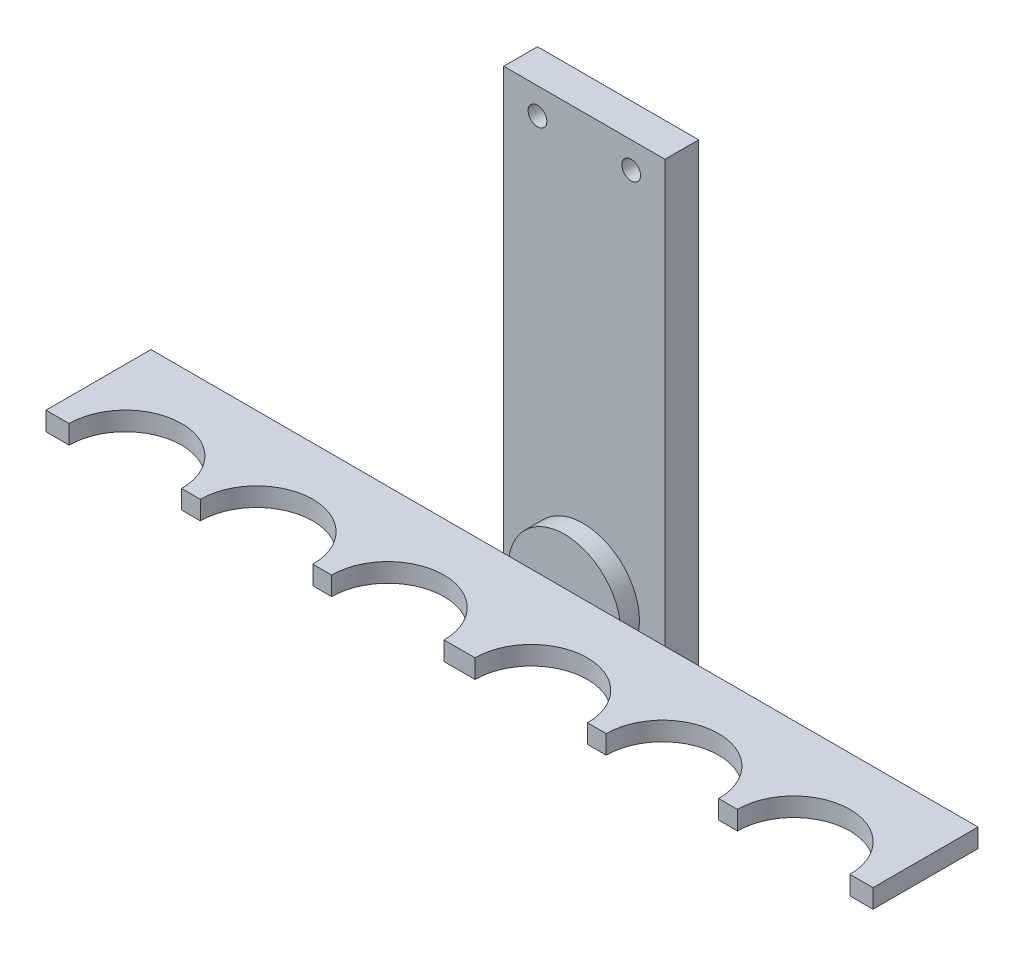
ISO-10303-21;
HEADER;
FILE_DESCRIPTION(('STEP AP214'),'2;1');
FILE_NAME('part.step','',(''),(''),'','','');
FILE_SCHEMA(('AUTOMOTIVE_DESIGN { 1 0 10303 214 1 1 1 1 }'));
ENDSEC;
DATA;
#1=APPLICATION_CONTEXT('core data for automotive mechanical design processes');
#2=APPLICATION_PROTOCOL_DEFINITION('international standard','automotive_design',2000,#1);
#3=PRODUCT_CONTEXT('',#1,'mechanical');
#4=PRODUCT('Part','Part','',(#3));
#5=PRODUCT_RELATED_PRODUCT_CATEGORY('part','',(#4));
#6=PRODUCT_DEFINITION_FORMATION('','',#4);
#7=PRODUCT_DEFINITION_CONTEXT('part definition',#1,'design');
#8=PRODUCT_DEFINITION('design','',#6,#7);
#9=PRODUCT_DEFINITION_SHAPE('','',#8);
#10=(LENGTH_UNIT() NAMED_UNIT(*) SI_UNIT(.MILLI.,.METRE.));
#11=(NAMED_UNIT(*) PLANE_ANGLE_UNIT() SI_UNIT($,.RADIAN.));
#12=(NAMED_UNIT(*) SI_UNIT($,.STERADIAN.) SOLID_ANGLE_UNIT());
#13=UNCERTAINTY_MEASURE_WITH_UNIT(LENGTH_MEASURE(1.E-05),#10,'distance_accuracy_value','');
#14=(GEOMETRIC_REPRESENTATION_CONTEXT(3) GLOBAL_UNCERTAINTY_ASSIGNED_CONTEXT((#13)) GLOBAL_UNIT_ASSIGNED_CONTEXT((#10,
#11,#12)) REPRESENTATION_CONTEXT('',''));
#15=CARTESIAN_POINT('',(0.,0.,0.));
#16=DIRECTION('',(0.,0.,1.));
#17=DIRECTION('',(1.,0.,0.));
#18=AXIS2_PLACEMENT_3D('',#15,#16,#17);
#19=CARTESIAN_POINT('',(0.,0.,42.));
#20=DIRECTION('',(0.,0.,1.));
#21=DIRECTION('',(1.,0.,0.));
#22=AXIS2_PLACEMENT_3D('',#19,#20,#21);
#23=PLANE('',#22);
#24=DIRECTION('',(0.,-1.,0.));
#25=VECTOR('',#24,1.);
#26=CARTESIAN_POINT('',(-104.127702362996,-78.9425675675676,42.));
#27=LINE('',#26,#25);
#28=CARTESIAN_POINT('',(-104.127702362996,-101.942567567568,42.));
#29=VERTEX_POINT('',#28);
#30=CARTESIAN_POINT('',(-104.127702362996,-106.942567567568,42.));
#31=VERTEX_POINT('',#30);
#32=EDGE_CURVE('E11',#29,#31,#27,.T.);
#33=ORIENTED_EDGE('',*,*,#32,.F.);
#34=DIRECTION('',(-1.,0.,0.));
#35=VECTOR('',#34,1.);
#36=CARTESIAN_POINT('',(-110.30095398785,-101.942567567568,42.));
#37=LINE('',#36,#35);
#38=CARTESIAN_POINT('',(-110.30095398785,-101.942567567568,42.));
#39=VERTEX_POINT('',#38);
#40=EDGE_CURVE('E333',#29,#39,#37,.T.);
#41=ORIENTED_EDGE('',*,*,#40,.T.);
#42=DIRECTION('',(0.,-1.,0.));
#43=VECTOR('',#42,1.);
#44=CARTESIAN_POINT('',(-110.30095398785,-101.942567567568,42.));
#45=LINE('',#44,#43);
#46=CARTESIAN_POINT('',(-110.30095398785,-106.942567567568,42.));
#47=VERTEX_POINT('',#46);
#48=EDGE_CURVE('E223',#39,#47,#45,.T.);
#49=ORIENTED_EDGE('',*,*,#48,.T.);
#50=DIRECTION('',(1.,0.,0.));
#51=VECTOR('',#50,1.);
#52=CARTESIAN_POINT('',(-110.30095398785,-106.942567567568,42.));
#53=LINE('',#52,#51);
#54=EDGE_CURVE('E217',#47,#31,#53,.T.);
#55=ORIENTED_EDGE('',*,*,#54,.T.);
#56=EDGE_LOOP('',(#33,#41,#49,#55));
#57=FACE_BOUND('',#56,.T.);
#58=ADVANCED_FACE('F35',(#57),#23,.T.);
#59=DIRECTION('',(0.,-1.,0.));
#60=VECTOR('',#59,1.);
#61=CARTESIAN_POINT('',(-74.1277023629965,-78.9425675675676,42.));
#62=LINE('',#61,#60);
#63=CARTESIAN_POINT('',(-74.1277023629965,-106.942567567568,42.));
#64=VERTEX_POINT('',#63);
#65=CARTESIAN_POINT('',(-74.1277023629965,-101.942567567568,42.));
#66=VERTEX_POINT('',#65);
#67=EDGE_CURVE('E43',#64,#66,#62,.F.);
#68=ORIENTED_EDGE('',*,*,#67,.F.);
#69=CARTESIAN_POINT('',(-69.1277023629965,-106.942567567568,42.));
#70=VERTEX_POINT('',#69);
#71=EDGE_CURVE('E215',#64,#70,#53,.T.);
#72=ORIENTED_EDGE('',*,*,#71,.T.);
#73=DIRECTION('',(0.,-1.,0.));
#74=VECTOR('',#73,1.);
#75=CARTESIAN_POINT('',(-69.1277023629965,-78.9425675675676,42.));
#76=LINE('',#75,#74);
#77=CARTESIAN_POINT('',(-69.1277023629965,-101.942567567568,42.));
#78=VERTEX_POINT('',#77);
#79=EDGE_CURVE('E315',#78,#70,#76,.T.);
#80=ORIENTED_EDGE('',*,*,#79,.F.);
#81=EDGE_CURVE('E331',#78,#66,#37,.T.);
#82=ORIENTED_EDGE('',*,*,#81,.T.);
#83=EDGE_LOOP('',(#68,#72,#80,#82));
#84=FACE_BOUND('',#83,.T.);
#85=ADVANCED_FACE('F337',(#84),#23,.T.);
#86=DIRECTION('',(0.,-1.,0.));
#87=VECTOR('',#86,1.);
#88=CARTESIAN_POINT('',(-39.1277023629965,-78.9425675675676,42.));
#89=LINE('',#88,#87);
#90=CARTESIAN_POINT('',(-39.1277023629965,-106.942567567568,42.));
#91=VERTEX_POINT('',#90);
#92=CARTESIAN_POINT('',(-39.1277023629965,-101.942567567568,42.));
#93=VERTEX_POINT('',#92);
#94=EDGE_CURVE('E313',#91,#93,#89,.F.);
#95=ORIENTED_EDGE('',*,*,#94,.F.);
#96=CARTESIAN_POINT('',(-34.1277023629965,-106.942567567568,42.));
#97=VERTEX_POINT('',#96);
#98=EDGE_CURVE('E212',#91,#97,#53,.T.);
#99=ORIENTED_EDGE('',*,*,#98,.T.);
#100=DIRECTION('',(0.,-1.,0.));
#101=VECTOR('',#100,1.);
#102=CARTESIAN_POINT('',(-34.1277023629965,-78.9425675675676,42.));
#103=LINE('',#102,#101);
#104=CARTESIAN_POINT('',(-34.1277023629965,-101.942567567568,42.));
#105=VERTEX_POINT('',#104);
#106=EDGE_CURVE('E311',#105,#97,#103,.T.);
#107=ORIENTED_EDGE('',*,*,#106,.F.);
#108=EDGE_CURVE('E338',#105,#93,#37,.T.);
#109=ORIENTED_EDGE('',*,*,#108,.T.);
#110=EDGE_LOOP('',(#95,#99,#107,#109));
#111=FACE_BOUND('',#110,.T.);
#112=ADVANCED_FACE('F371',(#111),#23,.T.);
#113=DIRECTION('',(0.,-1.,0.));
#114=VECTOR('',#113,1.);
#115=CARTESIAN_POINT('',(74.1277023629965,-78.9425675675676,42.));
#116=LINE('',#115,#114);
#117=CARTESIAN_POINT('',(74.1277023629965,-101.942567567568,42.));
#118=VERTEX_POINT('',#117);
#119=CARTESIAN_POINT('',(74.1277023629965,-106.942567567568,42.));
#120=VERTEX_POINT('',#119);
#121=EDGE_CURVE('E308',#118,#120,#116,.T.);
#122=ORIENTED_EDGE('',*,*,#121,.F.);
#123=CARTESIAN_POINT('',(69.1277023629965,-101.942567567568,42.));
#124=VERTEX_POINT('',#123);
#125=EDGE_CURVE('E344',#118,#124,#37,.T.);
#126=ORIENTED_EDGE('',*,*,#125,.T.);
#127=DIRECTION('',(0.,-1.,0.));
#128=VECTOR('',#127,1.);
#129=CARTESIAN_POINT('',(69.1277023629965,-78.9425675675676,42.));
#130=LINE('',#129,#128);
#131=CARTESIAN_POINT('',(69.1277023629965,-106.942567567568,42.));
#132=VERTEX_POINT('',#131);
#133=EDGE_CURVE('E196',#132,#124,#130,.F.);
#134=ORIENTED_EDGE('',*,*,#133,.F.);
#135=EDGE_CURVE('E216',#132,#120,#53,.T.);
#136=ORIENTED_EDGE('',*,*,#135,.T.);
#137=EDGE_LOOP('',(#122,#126,#134,#136));
#138=FACE_BOUND('',#137,.T.);
#139=ADVANCED_FACE('F384',(#138),#23,.T.);
#140=DIRECTION('',(0.,-1.,0.));
#141=VECTOR('',#140,1.);
#142=CARTESIAN_POINT('',(39.1277023629965,-78.9425675675676,42.));
#143=LINE('',#142,#141);
#144=CARTESIAN_POINT('',(39.1277023629965,-101.942567567568,42.));
#145=VERTEX_POINT('',#144);
#146=CARTESIAN_POINT('',(39.1277023629965,-106.942567567568,42.));
#147=VERTEX_POINT('',#146);
#148=EDGE_CURVE('E304',#145,#147,#143,.T.);
#149=ORIENTED_EDGE('',*,*,#148,.F.);
#150=CARTESIAN_POINT('',(34.1277023629965,-101.942567567568,42.));
#151=VERTEX_POINT('',#150);
#152=EDGE_CURVE('E375',#145,#151,#37,.T.);
#153=ORIENTED_EDGE('',*,*,#152,.T.);
#154=DIRECTION('',(0.,-1.,0.));
#155=VECTOR('',#154,1.);
#156=CARTESIAN_POINT('',(34.1277023629965,-78.9425675675676,42.));
#157=LINE('',#156,#155);
#158=CARTESIAN_POINT('',(34.1277023629965,-106.942567567568,42.));
#159=VERTEX_POINT('',#158);
#160=EDGE_CURVE('E197',#159,#151,#157,.F.);
#161=ORIENTED_EDGE('',*,*,#160,.F.);
#162=EDGE_CURVE('E207',#159,#147,#53,.T.);
#163=ORIENTED_EDGE('',*,*,#162,.T.);
#164=EDGE_LOOP('',(#149,#153,#161,#163));
#165=FACE_BOUND('',#164,.T.);
#166=ADVANCED_FACE('F388',(#165),#23,.T.);
#167=DIRECTION('',(0.,-1.,0.));
#168=VECTOR('',#167,1.);
#169=CARTESIAN_POINT('',(-4.12770236299648,-78.9425675675676,42.));
#170=LINE('',#169,#168);
#171=CARTESIAN_POINT('',(-4.12770236299648,-106.942567567568,42.));
#172=VERTEX_POINT('',#171);
#173=CARTESIAN_POINT('',(-4.12770236299648,-101.942567567568,42.));
#174=VERTEX_POINT('',#173);
#175=EDGE_CURVE('E211',#172,#174,#170,.F.);
#176=ORIENTED_EDGE('',*,*,#175,.F.);
#177=CARTESIAN_POINT('',(4.12770236299648,-106.942567567568,42.));
#178=VERTEX_POINT('',#177);
#179=EDGE_CURVE('E205',#172,#178,#53,.T.);
#180=ORIENTED_EDGE('',*,*,#179,.T.);
#181=DIRECTION('',(0.,-1.,0.));
#182=VECTOR('',#181,1.);
#183=CARTESIAN_POINT('',(4.12770236299648,-78.9425675675676,42.));
#184=LINE('',#183,#182);
#185=CARTESIAN_POINT('',(4.12770236299648,-101.942567567568,42.));
#186=VERTEX_POINT('',#185);
#187=EDGE_CURVE('E185',#186,#178,#184,.T.);
#188=ORIENTED_EDGE('',*,*,#187,.F.);
#189=EDGE_CURVE('E340',#186,#174,#37,.T.);
#190=ORIENTED_EDGE('',*,*,#189,.T.);
#191=EDGE_LOOP('',(#176,#180,#188,#190));
#192=FACE_BOUND('',#191,.T.);
#193=ADVANCED_FACE('F210',(#192),#23,.T.);
#194=CARTESIAN_POINT('',(0.,-104.442567567568,14.));
#195=DIRECTION('',(0.,0.,1.));
#196=DIRECTION('',(1.,0.,0.));
#197=AXIS2_PLACEMENT_3D('',#194,#195,#196);
#198=PLANE('',#197);
#199=DIRECTION('',(1.,0.,0.));
#200=VECTOR('',#199,1.);
#201=CARTESIAN_POINT('',(-110.30095398785,-106.942567567568,14.));
#202=LINE('',#201,#200);
#203=CARTESIAN_POINT('',(-14.790199457749,-106.942567567568,14.));
#204=VERTEX_POINT('',#203);
#205=CARTESIAN_POINT('',(14.790199457749,-106.942567567568,14.));
#206=VERTEX_POINT('',#205);
#207=EDGE_CURVE('E241',#204,#206,#202,.T.);
#208=ORIENTED_EDGE('',*,*,#207,.F.);
#209=CARTESIAN_POINT('',(0.,-104.442567567568,14.));
#210=DIRECTION('',(0.,0.,1.));
#211=DIRECTION('',(1.,0.,0.));
#212=AXIS2_PLACEMENT_3D('',#209,#210,#211);
#213=CIRCLE('',#212,15.);
#214=EDGE_CURVE('E433',#204,#206,#213,.T.);
#215=ORIENTED_EDGE('',*,*,#214,.T.);
#216=EDGE_LOOP('',(#208,#215));
#217=FACE_BOUND('',#216,.T.);
#218=ADVANCED_FACE('F395',(#217),#198,.T.);
#219=CARTESIAN_POINT('',(21.7905405405406,0.,9.));
#220=DIRECTION('',(-1.,0.,0.));
#221=DIRECTION('',(0.,-1.,0.));
#222=AXIS2_PLACEMENT_3D('',#219,#220,#221);
#223=PLANE('',#222);
#224=DIRECTION('',(0.,1.,0.));
#225=VECTOR('',#224,1.);
#226=CARTESIAN_POINT('',(21.7905405405406,0.,0.));
#227=LINE('',#226,#225);
#228=CARTESIAN_POINT('',(21.7905405405405,-119.442567567568,0.));
#229=VERTEX_POINT('',#228);
#230=CARTESIAN_POINT('',(21.7905405405406,5.55743243243242,0.));
#231=VERTEX_POINT('',#230);
#232=EDGE_CURVE('E256',#229,#231,#227,.T.);
#233=ORIENTED_EDGE('',*,*,#232,.T.);
#234=DIRECTION('',(0.,0.,-1.));
#235=VECTOR('',#234,1.);
#236=CARTESIAN_POINT('',(21.7905405405406,5.55743243243242,9.));
#237=LINE('',#236,#235);
#238=CARTESIAN_POINT('',(21.7905405405406,5.55743243243242,9.));
#239=VERTEX_POINT('',#238);
#240=EDGE_CURVE('E300',#239,#231,#237,.T.);
#241=ORIENTED_EDGE('',*,*,#240,.F.);
#242=DIRECTION('',(0.,1.,0.));
#243=VECTOR('',#242,1.);
#244=CARTESIAN_POINT('',(21.7905405405406,0.,9.));
#245=LINE('',#244,#243);
#246=CARTESIAN_POINT('',(21.7905405405405,-119.442567567568,9.));
#247=VERTEX_POINT('',#246);
#248=EDGE_CURVE('E261',#247,#239,#245,.T.);
#249=ORIENTED_EDGE('',*,*,#248,.F.);
#250=DIRECTION('',(0.,0.,-1.));
#251=VECTOR('',#250,1.);
#252=CARTESIAN_POINT('',(21.7905405405405,-119.442567567568,9.));
#253=LINE('',#252,#251);
#254=EDGE_CURVE('E278',#247,#229,#253,.T.);
#255=ORIENTED_EDGE('',*,*,#254,.T.);
#256=EDGE_LOOP('',(#233,#241,#249,#255));
#257=FACE_BOUND('',#256,.T.);
#258=ADVANCED_FACE('F37',(#257),#223,.F.);
#259=CARTESIAN_POINT('',(0.,5.55743243243242,9.));
#260=DIRECTION('',(0.,1.,0.));
#261=DIRECTION('',(0.,0.,1.));
#262=AXIS2_PLACEMENT_3D('',#259,#260,#261);
#263=PLANE('',#262);
#264=DIRECTION('',(1.,0.,0.));
#265=VECTOR('',#264,1.);
#266=CARTESIAN_POINT('',(0.,5.55743243243242,0.));
#267=LINE('',#266,#265);
#268=CARTESIAN_POINT('',(-21.2094594594594,5.55743243243242,0.));
#269=VERTEX_POINT('',#268);
#270=EDGE_CURVE('E281',#269,#231,#267,.T.);
#271=ORIENTED_EDGE('',*,*,#270,.F.);
#272=DIRECTION('',(0.,0.,-1.));
#273=VECTOR('',#272,1.);
#274=CARTESIAN_POINT('',(-21.2094594594594,5.55743243243242,9.));
#275=LINE('',#274,#273);
#276=CARTESIAN_POINT('',(-21.2094594594594,5.55743243243242,9.));
#277=VERTEX_POINT('',#276);
#278=EDGE_CURVE('E298',#277,#269,#275,.T.);
#279=ORIENTED_EDGE('',*,*,#278,.F.);
#280=DIRECTION('',(1.,0.,0.));
#281=VECTOR('',#280,1.);
#282=CARTESIAN_POINT('',(0.,5.55743243243242,9.));
#283=LINE('',#282,#281);
#284=EDGE_CURVE('E263',#277,#239,#283,.T.);
#285=ORIENTED_EDGE('',*,*,#284,.T.);
#286=ORIENTED_EDGE('',*,*,#240,.T.);
#287=EDGE_LOOP('',(#271,#279,#285,#286));
#288=FACE_BOUND('',#287,.T.);
#289=ADVANCED_FACE('F483',(#288),#263,.T.);
#290=CARTESIAN_POINT('',(-21.2094594594594,0.,9.));
#291=DIRECTION('',(1.,0.,0.));
#292=DIRECTION('',(0.,1.,0.));
#293=AXIS2_PLACEMENT_3D('',#290,#291,#292);
#294=PLANE('',#293);
#295=DIRECTION('',(0.,-1.,0.));
#296=VECTOR('',#295,1.);
#297=CARTESIAN_POINT('',(-21.2094594594594,0.,0.));
#298=LINE('',#297,#296);
#299=CARTESIAN_POINT('',(-21.2094594594594,-119.442567567568,0.));
#300=VERTEX_POINT('',#299);
#301=EDGE_CURVE('E284',#269,#300,#298,.T.);
#302=ORIENTED_EDGE('',*,*,#301,.T.);
#303=DIRECTION('',(0.,0.,-1.));
#304=VECTOR('',#303,1.);
#305=CARTESIAN_POINT('',(-21.2094594594594,-119.442567567568,9.));
#306=LINE('',#305,#304);
#307=CARTESIAN_POINT('',(-21.2094594594594,-119.442567567568,9.));
#308=VERTEX_POINT('',#307);
#309=EDGE_CURVE('E295',#308,#300,#306,.T.);
#310=ORIENTED_EDGE('',*,*,#309,.F.);
#311=DIRECTION('',(0.,-1.,0.));
#312=VECTOR('',#311,1.);
#313=CARTESIAN_POINT('',(-21.2094594594594,0.,9.));
#314=LINE('',#313,#312);
#315=EDGE_CURVE('E267',#277,#308,#314,.T.);
#316=ORIENTED_EDGE('',*,*,#315,.F.);
#317=ORIENTED_EDGE('',*,*,#278,.T.);
#318=EDGE_LOOP('',(#302,#310,#316,#317));
#319=FACE_BOUND('',#318,.T.);
#320=ADVANCED_FACE('F477',(#319),#294,.F.);
#321=CARTESIAN_POINT('',(12.7905405405406,-1.44256756756757,9.));
#322=DIRECTION('',(0.,0.,-1.));
#323=DIRECTION('',(-1.,0.,0.));
#324=AXIS2_PLACEMENT_3D('',#321,#322,#323);
#325=CYLINDRICAL_SURFACE('',#324,2.5);
#326=CARTESIAN_POINT('',(12.7905405405406,-1.44256756756757,9.));
#327=DIRECTION('',(0.,0.,1.));
#328=DIRECTION('',(1.,0.,0.));
#329=AXIS2_PLACEMENT_3D('',#326,#327,#328);
#330=CIRCLE('',#329,2.5);
#331=CARTESIAN_POINT('',(15.2905405405406,-1.44256756756757,9.));
#332=VERTEX_POINT('',#331);
#333=EDGE_CURVE('E272',#332,#332,#330,.F.);
#334=ORIENTED_EDGE('',*,*,#333,.F.);
#335=EDGE_LOOP('',(#334));
#336=FACE_BOUND('',#335,.T.);
#337=CARTESIAN_POINT('',(12.7905405405406,-1.44256756756757,0.));
#338=DIRECTION('',(0.,0.,1.));
#339=DIRECTION('',(1.,0.,0.));
#340=AXIS2_PLACEMENT_3D('',#337,#338,#339);
#341=CIRCLE('',#340,2.5);
#342=CARTESIAN_POINT('',(15.2905405405406,-1.44256756756757,0.));
#343=VERTEX_POINT('',#342);
#344=EDGE_CURVE('E288',#343,#343,#341,.F.);
#345=ORIENTED_EDGE('',*,*,#344,.T.);
#346=EDGE_LOOP('',(#345));
#347=FACE_BOUND('',#346,.T.);
#348=ADVANCED_FACE('F474',(#336,#347),#325,.F.);
#349=CARTESIAN_POINT('',(0.,-119.442567567568,9.));
#350=DIRECTION('',(0.,1.,0.));
#351=DIRECTION('',(0.,0.,1.));
#352=AXIS2_PLACEMENT_3D('',#349,#350,#351);
#353=PLANE('',#352);
#354=DIRECTION('',(1.,0.,0.));
#355=VECTOR('',#354,1.);
#356=CARTESIAN_POINT('',(0.,-119.442567567568,0.));
#357=LINE('',#356,#355);
#358=EDGE_CURVE('E286',#300,#229,#357,.T.);
#359=ORIENTED_EDGE('',*,*,#358,.T.);
#360=ORIENTED_EDGE('',*,*,#254,.F.);
#361=DIRECTION('',(1.,0.,0.));
#362=VECTOR('',#361,1.);
#363=CARTESIAN_POINT('',(0.,-119.442567567568,9.));
#364=LINE('',#363,#362);
#365=CARTESIAN_POINT('',(0.,-119.442567567568,9.));
#366=VERTEX_POINT('',#365);
#367=EDGE_CURVE('E269',#366,#247,#364,.T.);
#368=ORIENTED_EDGE('',*,*,#367,.F.);
#369=EDGE_CURVE('E270',#308,#366,#364,.T.);
#370=ORIENTED_EDGE('',*,*,#369,.F.);
#371=ORIENTED_EDGE('',*,*,#309,.T.);
#372=EDGE_LOOP('',(#359,#360,#368,#370,#371));
#373=FACE_BOUND('',#372,.T.);
#374=ADVANCED_FACE('F472',(#373),#353,.F.);
#375=CARTESIAN_POINT('',(-12.2094594594594,-1.44256756756758,9.));
#376=DIRECTION('',(0.,0.,-1.));
#377=DIRECTION('',(-1.,0.,0.));
#378=AXIS2_PLACEMENT_3D('',#375,#376,#377);
#379=CYLINDRICAL_SURFACE('',#378,2.5);
#380=CARTESIAN_POINT('',(-12.2094594594594,-1.44256756756758,9.));
#381=DIRECTION('',(0.,0.,1.));
#382=DIRECTION('',(1.,0.,0.));
#383=AXIS2_PLACEMENT_3D('',#380,#381,#382);
#384=CIRCLE('',#383,2.5);
#385=CARTESIAN_POINT('',(-9.70945945945944,-1.44256756756758,9.));
#386=VERTEX_POINT('',#385);
#387=EDGE_CURVE('E275',#386,#386,#384,.T.);
#388=ORIENTED_EDGE('',*,*,#387,.T.);
#389=EDGE_LOOP('',(#388));
#390=FACE_BOUND('',#389,.T.);
#391=CARTESIAN_POINT('',(-12.2094594594594,-1.44256756756758,0.));
#392=DIRECTION('',(0.,0.,1.));
#393=DIRECTION('',(1.,0.,0.));
#394=AXIS2_PLACEMENT_3D('',#391,#392,#393);
#395=CIRCLE('',#394,2.5);
#396=CARTESIAN_POINT('',(-9.70945945945944,-1.44256756756758,0.));
#397=VERTEX_POINT('',#396);
#398=EDGE_CURVE('E264',#397,#397,#395,.T.);
#399=ORIENTED_EDGE('',*,*,#398,.F.);
#400=EDGE_LOOP('',(#399));
#401=FACE_BOUND('',#400,.T.);
#402=ADVANCED_FACE('F465',(#390,#401),#379,.F.);
#403=CARTESIAN_POINT('',(0.,0.,9.));
#404=DIRECTION('',(0.,0.,1.));
#405=DIRECTION('',(1.,0.,0.));
#406=AXIS2_PLACEMENT_3D('',#403,#404,#405);
#407=PLANE('',#406);
#408=ORIENTED_EDGE('',*,*,#369,.T.);
#409=CARTESIAN_POINT('',(0.,-104.442567567568,9.));
#410=DIRECTION('',(0.,0.,1.));
#411=DIRECTION('',(1.,0.,0.));
#412=AXIS2_PLACEMENT_3D('',#409,#410,#411);
#413=CIRCLE('',#412,15.);
#414=EDGE_CURVE('E253',#366,#366,#413,.T.);
#415=ORIENTED_EDGE('',*,*,#414,.F.);
#416=ORIENTED_EDGE('',*,*,#367,.T.);
#417=ORIENTED_EDGE('',*,*,#248,.T.);
#418=ORIENTED_EDGE('',*,*,#284,.F.);
#419=ORIENTED_EDGE('',*,*,#315,.T.);
#420=EDGE_LOOP('',(#408,#415,#416,#417,#418,#419));
#421=FACE_BOUND('',#420,.T.);
#422=ORIENTED_EDGE('',*,*,#333,.T.);
#423=EDGE_LOOP('',(#422));
#424=FACE_BOUND('',#423,.T.);
#425=ORIENTED_EDGE('',*,*,#387,.F.);
#426=EDGE_LOOP('',(#425));
#427=FACE_BOUND('',#426,.T.);
#428=ADVANCED_FACE('F462',(#421,#424,#427),#407,.T.);
#429=CARTESIAN_POINT('',(0.,0.,0.));
#430=DIRECTION('',(0.,0.,1.));
#431=DIRECTION('',(1.,0.,0.));
#432=AXIS2_PLACEMENT_3D('',#429,#430,#431);
#433=PLANE('',#432);
#434=ORIENTED_EDGE('',*,*,#232,.F.);
#435=ORIENTED_EDGE('',*,*,#358,.F.);
#436=ORIENTED_EDGE('',*,*,#301,.F.);
#437=ORIENTED_EDGE('',*,*,#270,.T.);
#438=EDGE_LOOP('',(#434,#435,#436,#437));
#439=FACE_BOUND('',#438,.T.);
#440=ORIENTED_EDGE('',*,*,#344,.F.);
#441=EDGE_LOOP('',(#440));
#442=FACE_BOUND('',#441,.T.);
#443=ORIENTED_EDGE('',*,*,#398,.T.);
#444=EDGE_LOOP('',(#443));
#445=FACE_BOUND('',#444,.T.);
#446=ADVANCED_FACE('F461',(#439,#442,#445),#433,.F.);
#447=CARTESIAN_POINT('',(0.,-104.442567567568,14.));
#448=DIRECTION('',(0.,0.,-1.));
#449=DIRECTION('',(-1.,0.,0.));
#450=AXIS2_PLACEMENT_3D('',#447,#448,#449);
#451=CYLINDRICAL_SURFACE('',#450,15.);
#452=CARTESIAN_POINT('',(14.790199457749,-101.942567567568,14.));
#453=VERTEX_POINT('',#452);
#454=CARTESIAN_POINT('',(-14.790199457749,-101.942567567568,14.));
#455=VERTEX_POINT('',#454);
#456=EDGE_CURVE('E254',#453,#455,#213,.T.);
#457=ORIENTED_EDGE('',*,*,#456,.F.);
#458=EDGE_CURVE('E258',#206,#453,#213,.T.);
#459=ORIENTED_EDGE('',*,*,#458,.F.);
#460=ORIENTED_EDGE('',*,*,#214,.F.);
#461=EDGE_CURVE('E257',#455,#204,#213,.T.);
#462=ORIENTED_EDGE('',*,*,#461,.F.);
#463=EDGE_LOOP('',(#457,#459,#460,#462));
#464=FACE_BOUND('',#463,.T.);
#465=ORIENTED_EDGE('',*,*,#414,.T.);
#466=EDGE_LOOP('',(#465));
#467=FACE_BOUND('',#466,.T.);
#468=ADVANCED_FACE('F457',(#464,#467),#451,.T.);
#469=DIRECTION('',(-1.,0.,0.));
#470=VECTOR('',#469,1.);
#471=CARTESIAN_POINT('',(-110.30095398785,-101.942567567568,14.));
#472=LINE('',#471,#470);
#473=EDGE_CURVE('E234',#453,#455,#472,.T.);
#474=ORIENTED_EDGE('',*,*,#473,.F.);
#475=ORIENTED_EDGE('',*,*,#456,.T.);
#476=EDGE_LOOP('',(#474,#475));
#477=FACE_BOUND('',#476,.T.);
#478=ADVANCED_FACE('F454',(#477),#198,.T.);
#479=CARTESIAN_POINT('',(0.,0.,14.));
#480=DIRECTION('',(0.,0.,1.));
#481=DIRECTION('',(1.,0.,0.));
#482=AXIS2_PLACEMENT_3D('',#479,#480,#481);
#483=PLANE('',#482);
#484=CARTESIAN_POINT('',(-110.30095398785,-101.942567567568,14.));
#485=VERTEX_POINT('',#484);
#486=EDGE_CURVE('E228',#455,#485,#472,.T.);
#487=ORIENTED_EDGE('',*,*,#486,.F.);
#488=ORIENTED_EDGE('',*,*,#461,.T.);
#489=CARTESIAN_POINT('',(-110.30095398785,-106.942567567568,14.));
#490=VERTEX_POINT('',#489);
#491=EDGE_CURVE('E237',#490,#204,#202,.T.);
#492=ORIENTED_EDGE('',*,*,#491,.F.);
#493=DIRECTION('',(0.,-1.,0.));
#494=VECTOR('',#493,1.);
#495=CARTESIAN_POINT('',(-110.30095398785,-101.942567567568,14.));
#496=LINE('',#495,#494);
#497=EDGE_CURVE('E233',#485,#490,#496,.T.);
#498=ORIENTED_EDGE('',*,*,#497,.F.);
#499=EDGE_LOOP('',(#487,#488,#492,#498));
#500=FACE_BOUND('',#499,.T.);
#501=ADVANCED_FACE('F427',(#500),#483,.F.);
#502=CARTESIAN_POINT('',(110.30095398785,-106.942567567568,14.));
#503=VERTEX_POINT('',#502);
#504=EDGE_CURVE('E236',#206,#503,#202,.T.);
#505=ORIENTED_EDGE('',*,*,#504,.F.);
#506=ORIENTED_EDGE('',*,*,#458,.T.);
#507=CARTESIAN_POINT('',(110.30095398785,-101.942567567568,14.));
#508=VERTEX_POINT('',#507);
#509=EDGE_CURVE('E230',#508,#453,#472,.T.);
#510=ORIENTED_EDGE('',*,*,#509,.F.);
#511=DIRECTION('',(0.,1.,0.));
#512=VECTOR('',#511,1.);
#513=CARTESIAN_POINT('',(110.30095398785,-101.942567567568,14.));
#514=LINE('',#513,#512);
#515=EDGE_CURVE('E225',#503,#508,#514,.T.);
#516=ORIENTED_EDGE('',*,*,#515,.F.);
#517=EDGE_LOOP('',(#505,#506,#510,#516));
#518=FACE_BOUND('',#517,.T.);
#519=ADVANCED_FACE('F439',(#518),#483,.F.);
#520=CARTESIAN_POINT('',(110.30095398785,-101.942567567568,42.));
#521=DIRECTION('',(-1.,0.,0.));
#522=DIRECTION('',(0.,0.,1.));
#523=AXIS2_PLACEMENT_3D('',#520,#521,#522);
#524=PLANE('',#523);
#525=ORIENTED_EDGE('',*,*,#515,.T.);
#526=DIRECTION('',(0.,0.,-1.));
#527=VECTOR('',#526,1.);
#528=CARTESIAN_POINT('',(110.30095398785,-101.942567567568,42.));
#529=LINE('',#528,#527);
#530=CARTESIAN_POINT('',(110.30095398785,-101.942567567568,42.));
#531=VERTEX_POINT('',#530);
#532=EDGE_CURVE('E250',#531,#508,#529,.T.);
#533=ORIENTED_EDGE('',*,*,#532,.F.);
#534=DIRECTION('',(0.,1.,0.));
#535=VECTOR('',#534,1.);
#536=CARTESIAN_POINT('',(110.30095398785,-101.942567567568,42.));
#537=LINE('',#536,#535);
#538=CARTESIAN_POINT('',(110.30095398785,-106.942567567568,42.));
#539=VERTEX_POINT('',#538);
#540=EDGE_CURVE('E240',#539,#531,#537,.T.);
#541=ORIENTED_EDGE('',*,*,#540,.F.);
#542=DIRECTION('',(0.,0.,-1.));
#543=VECTOR('',#542,1.);
#544=CARTESIAN_POINT('',(110.30095398785,-106.942567567568,42.));
#545=LINE('',#544,#543);
#546=EDGE_CURVE('E221',#539,#503,#545,.T.);
#547=ORIENTED_EDGE('',*,*,#546,.T.);
#548=EDGE_LOOP('',(#525,#533,#541,#547));
#549=FACE_BOUND('',#548,.T.);
#550=ADVANCED_FACE('F443',(#549),#524,.F.);
#551=CARTESIAN_POINT('',(-110.30095398785,-101.942567567568,42.));
#552=DIRECTION('',(0.,-1.,0.));
#553=DIRECTION('',(0.,0.,-1.));
#554=AXIS2_PLACEMENT_3D('',#551,#552,#553);
#555=PLANE('',#554);
#556=ORIENTED_EDGE('',*,*,#40,.F.);
#557=CARTESIAN_POINT('',(-89.1277023629965,-101.942567567568,42.));
#558=DIRECTION('',(0.,-1.,0.));
#559=DIRECTION('',(0.,0.,-1.));
#560=AXIS2_PLACEMENT_3D('',#557,#558,#559);
#561=CIRCLE('',#560,15.);
#562=EDGE_CURVE('E229',#29,#66,#561,.T.);
#563=ORIENTED_EDGE('',*,*,#562,.T.);
#564=ORIENTED_EDGE('',*,*,#81,.F.);
#565=CARTESIAN_POINT('',(-54.1277023629965,-101.942567567568,42.));
#566=DIRECTION('',(0.,-1.,0.));
#567=DIRECTION('',(0.,0.,-1.));
#568=AXIS2_PLACEMENT_3D('',#565,#566,#567);
#569=CIRCLE('',#568,15.);
#570=EDGE_CURVE('E334',#78,#93,#569,.T.);
#571=ORIENTED_EDGE('',*,*,#570,.T.);
#572=ORIENTED_EDGE('',*,*,#108,.F.);
#573=CARTESIAN_POINT('',(-19.1277023629965,-101.942567567568,42.));
#574=DIRECTION('',(0.,-1.,0.));
#575=DIRECTION('',(0.,0.,-1.));
#576=AXIS2_PLACEMENT_3D('',#573,#574,#575);
#577=CIRCLE('',#576,15.);
#578=EDGE_CURVE('E348',#105,#174,#577,.T.);
#579=ORIENTED_EDGE('',*,*,#578,.T.);
#580=ORIENTED_EDGE('',*,*,#189,.F.);
#581=CARTESIAN_POINT('',(19.1277023629965,-101.942567567568,42.));
#582=DIRECTION('',(0.,-1.,0.));
#583=DIRECTION('',(0.,0.,-1.));
#584=AXIS2_PLACEMENT_3D('',#581,#582,#583);
#585=CIRCLE('',#584,15.);
#586=EDGE_CURVE('E191',#186,#151,#585,.T.);
#587=ORIENTED_EDGE('',*,*,#586,.T.);
#588=ORIENTED_EDGE('',*,*,#152,.F.);
#589=CARTESIAN_POINT('',(54.1277023629965,-101.942567567568,42.));
#590=DIRECTION('',(0.,-1.,0.));
#591=DIRECTION('',(0.,0.,-1.));
#592=AXIS2_PLACEMENT_3D('',#589,#590,#591);
#593=CIRCLE('',#592,15.);
#594=EDGE_CURVE('E354',#145,#124,#593,.T.);
#595=ORIENTED_EDGE('',*,*,#594,.T.);
#596=ORIENTED_EDGE('',*,*,#125,.F.);
#597=CARTESIAN_POINT('',(89.1277023629965,-101.942567567568,42.));
#598=DIRECTION('',(0.,-1.,0.));
#599=DIRECTION('',(0.,0.,-1.));
#600=AXIS2_PLACEMENT_3D('',#597,#598,#599);
#601=CIRCLE('',#600,15.);
#602=CARTESIAN_POINT('',(104.127702362996,-101.942567567568,42.));
#603=VERTEX_POINT('',#602);
#604=EDGE_CURVE('E351',#118,#603,#601,.T.);
#605=ORIENTED_EDGE('',*,*,#604,.T.);
#606=EDGE_CURVE('E341',#531,#603,#37,.T.);
#607=ORIENTED_EDGE('',*,*,#606,.F.);
#608=ORIENTED_EDGE('',*,*,#532,.T.);
#609=ORIENTED_EDGE('',*,*,#509,.T.);
#610=ORIENTED_EDGE('',*,*,#473,.T.);
#611=ORIENTED_EDGE('',*,*,#486,.T.);
#612=DIRECTION('',(0.,0.,-1.));
#613=VECTOR('',#612,1.);
#614=CARTESIAN_POINT('',(-110.30095398785,-101.942567567568,42.));
#615=LINE('',#614,#613);
#616=EDGE_CURVE('E247',#39,#485,#615,.T.);
#617=ORIENTED_EDGE('',*,*,#616,.F.);
#618=EDGE_LOOP('',(#556,#563,#564,#571,#572,#579,#580,#587,#588,#595,#596,#605,#607,#608,#609,
#610,#611,#617));
#619=FACE_BOUND('',#618,.T.);
#620=ADVANCED_FACE('F329',(#619),#555,.F.);
#621=CARTESIAN_POINT('',(-110.30095398785,-101.942567567568,42.));
#622=DIRECTION('',(1.,0.,0.));
#623=DIRECTION('',(0.,0.,-1.));
#624=AXIS2_PLACEMENT_3D('',#621,#622,#623);
#625=PLANE('',#624);
#626=ORIENTED_EDGE('',*,*,#497,.T.);
#627=DIRECTION('',(0.,0.,-1.));
#628=VECTOR('',#627,1.);
#629=CARTESIAN_POINT('',(-110.30095398785,-106.942567567568,42.));
#630=LINE('',#629,#628);
#631=EDGE_CURVE('E244',#47,#490,#630,.T.);
#632=ORIENTED_EDGE('',*,*,#631,.F.);
#633=ORIENTED_EDGE('',*,*,#48,.F.);
#634=ORIENTED_EDGE('',*,*,#616,.T.);
#635=EDGE_LOOP('',(#626,#632,#633,#634));
#636=FACE_BOUND('',#635,.T.);
#637=ADVANCED_FACE('F412',(#636),#625,.F.);
#638=CARTESIAN_POINT('',(-110.30095398785,-106.942567567568,42.));
#639=DIRECTION('',(0.,1.,0.));
#640=DIRECTION('',(0.,0.,1.));
#641=AXIS2_PLACEMENT_3D('',#638,#639,#640);
#642=PLANE('',#641);
#643=ORIENTED_EDGE('',*,*,#71,.F.);
#644=CARTESIAN_POINT('',(-89.1277023629965,-106.942567567568,42.));
#645=DIRECTION('',(0.,-1.,0.));
#646=DIRECTION('',(0.,0.,1.));
#647=AXIS2_PLACEMENT_3D('',#644,#645,#646);
#648=CIRCLE('',#647,15.);
#649=EDGE_CURVE('E322',#31,#64,#648,.T.);
#650=ORIENTED_EDGE('',*,*,#649,.F.);
#651=ORIENTED_EDGE('',*,*,#54,.F.);
#652=ORIENTED_EDGE('',*,*,#631,.T.);
#653=ORIENTED_EDGE('',*,*,#491,.T.);
#654=ORIENTED_EDGE('',*,*,#207,.T.);
#655=ORIENTED_EDGE('',*,*,#504,.T.);
#656=ORIENTED_EDGE('',*,*,#546,.F.);
#657=CARTESIAN_POINT('',(104.127702362996,-106.942567567568,42.));
#658=VERTEX_POINT('',#657);
#659=EDGE_CURVE('E222',#658,#539,#53,.T.);
#660=ORIENTED_EDGE('',*,*,#659,.F.);
#661=CARTESIAN_POINT('',(89.1277023629965,-106.942567567568,42.));
#662=DIRECTION('',(0.,-1.,0.));
#663=DIRECTION('',(0.,0.,-1.));
#664=AXIS2_PLACEMENT_3D('',#661,#662,#663);
#665=CIRCLE('',#664,15.);
#666=EDGE_CURVE('E50',#120,#658,#665,.T.);
#667=ORIENTED_EDGE('',*,*,#666,.F.);
#668=ORIENTED_EDGE('',*,*,#135,.F.);
#669=CARTESIAN_POINT('',(54.1277023629965,-106.942567567568,42.));
#670=DIRECTION('',(0.,-1.,0.));
#671=DIRECTION('',(0.,0.,-1.));
#672=AXIS2_PLACEMENT_3D('',#669,#670,#671);
#673=CIRCLE('',#672,15.);
#674=EDGE_CURVE('E58',#147,#132,#673,.T.);
#675=ORIENTED_EDGE('',*,*,#674,.F.);
#676=ORIENTED_EDGE('',*,*,#162,.F.);
#677=CARTESIAN_POINT('',(19.1277023629965,-106.942567567568,42.));
#678=DIRECTION('',(0.,-1.,0.));
#679=DIRECTION('',(0.,0.,-1.));
#680=AXIS2_PLACEMENT_3D('',#677,#678,#679);
#681=CIRCLE('',#680,15.);
#682=EDGE_CURVE('E188',#178,#159,#681,.T.);
#683=ORIENTED_EDGE('',*,*,#682,.F.);
#684=ORIENTED_EDGE('',*,*,#179,.F.);
#685=CARTESIAN_POINT('',(-19.1277023629965,-106.942567567568,42.));
#686=DIRECTION('',(0.,-1.,0.));
#687=DIRECTION('',(0.,0.,1.));
#688=AXIS2_PLACEMENT_3D('',#685,#686,#687);
#689=CIRCLE('',#688,15.);
#690=EDGE_CURVE('E361',#97,#172,#689,.T.);
#691=ORIENTED_EDGE('',*,*,#690,.F.);
#692=ORIENTED_EDGE('',*,*,#98,.F.);
#693=CARTESIAN_POINT('',(-54.1277023629965,-106.942567567568,42.));
#694=DIRECTION('',(0.,-1.,0.));
#695=DIRECTION('',(0.,0.,1.));
#696=AXIS2_PLACEMENT_3D('',#693,#694,#695);
#697=CIRCLE('',#696,15.);
#698=EDGE_CURVE('E359',#70,#91,#697,.T.);
#699=ORIENTED_EDGE('',*,*,#698,.F.);
#700=EDGE_LOOP('',(#643,#650,#651,#652,#653,#654,#655,#656,#660,#667,#668,#675,#676,#683,#684,
#691,#692,#699));
#701=FACE_BOUND('',#700,.T.);
#702=ADVANCED_FACE('F203',(#701),#642,.F.);
#703=DIRECTION('',(0.,-1.,0.));
#704=VECTOR('',#703,1.);
#705=CARTESIAN_POINT('',(104.127702362996,-78.9425675675676,42.));
#706=LINE('',#705,#704);
#707=EDGE_CURVE('E306',#658,#603,#706,.F.);
#708=ORIENTED_EDGE('',*,*,#707,.F.);
#709=ORIENTED_EDGE('',*,*,#659,.T.);
#710=ORIENTED_EDGE('',*,*,#540,.T.);
#711=ORIENTED_EDGE('',*,*,#606,.T.);
#712=EDGE_LOOP('',(#708,#709,#710,#711));
#713=FACE_BOUND('',#712,.T.);
#714=ADVANCED_FACE('F396',(#713),#23,.T.);
#715=CARTESIAN_POINT('',(19.1277023629965,-78.9425675675676,42.));
#716=DIRECTION('',(0.,-1.,0.));
#717=DIRECTION('',(0.,0.,-1.));
#718=AXIS2_PLACEMENT_3D('',#715,#716,#717);
#719=CYLINDRICAL_SURFACE('',#718,15.);
#720=ORIENTED_EDGE('',*,*,#187,.T.);
#721=ORIENTED_EDGE('',*,*,#682,.T.);
#722=ORIENTED_EDGE('',*,*,#160,.T.);
#723=ORIENTED_EDGE('',*,*,#586,.F.);
#724=EDGE_LOOP('',(#720,#721,#722,#723));
#725=FACE_BOUND('',#724,.T.);
#726=ADVANCED_FACE('F187',(#725),#719,.F.);
#727=CARTESIAN_POINT('',(54.1277023629965,-78.9425675675676,42.));
#728=DIRECTION('',(0.,-1.,0.));
#729=DIRECTION('',(0.,0.,-1.));
#730=AXIS2_PLACEMENT_3D('',#727,#728,#729);
#731=CYLINDRICAL_SURFACE('',#730,15.);
#732=ORIENTED_EDGE('',*,*,#148,.T.);
#733=ORIENTED_EDGE('',*,*,#674,.T.);
#734=ORIENTED_EDGE('',*,*,#133,.T.);
#735=ORIENTED_EDGE('',*,*,#594,.F.);
#736=EDGE_LOOP('',(#732,#733,#734,#735));
#737=FACE_BOUND('',#736,.T.);
#738=ADVANCED_FACE('F387',(#737),#731,.F.);
#739=CARTESIAN_POINT('',(89.1277023629965,-78.9425675675676,42.));
#740=DIRECTION('',(0.,-1.,0.));
#741=DIRECTION('',(0.,0.,-1.));
#742=AXIS2_PLACEMENT_3D('',#739,#740,#741);
#743=CYLINDRICAL_SURFACE('',#742,15.);
#744=ORIENTED_EDGE('',*,*,#121,.T.);
#745=ORIENTED_EDGE('',*,*,#666,.T.);
#746=ORIENTED_EDGE('',*,*,#707,.T.);
#747=ORIENTED_EDGE('',*,*,#604,.F.);
#748=EDGE_LOOP('',(#744,#745,#746,#747));
#749=FACE_BOUND('',#748,.T.);
#750=ADVANCED_FACE('F613',(#749),#743,.F.);
#751=CARTESIAN_POINT('',(-19.1277023629965,-78.9425675675676,42.));
#752=DIRECTION('',(0.,-1.,0.));
#753=DIRECTION('',(0.,0.,-1.));
#754=AXIS2_PLACEMENT_3D('',#751,#752,#753);
#755=CYLINDRICAL_SURFACE('',#754,15.);
#756=ORIENTED_EDGE('',*,*,#106,.T.);
#757=ORIENTED_EDGE('',*,*,#690,.T.);
#758=ORIENTED_EDGE('',*,*,#175,.T.);
#759=ORIENTED_EDGE('',*,*,#578,.F.);
#760=EDGE_LOOP('',(#756,#757,#758,#759));
#761=FACE_BOUND('',#760,.T.);
#762=ADVANCED_FACE('F365',(#761),#755,.F.);
#763=CARTESIAN_POINT('',(-54.1277023629965,-78.9425675675676,42.));
#764=DIRECTION('',(0.,-1.,0.));
#765=DIRECTION('',(0.,0.,-1.));
#766=AXIS2_PLACEMENT_3D('',#763,#764,#765);
#767=CYLINDRICAL_SURFACE('',#766,15.);
#768=ORIENTED_EDGE('',*,*,#79,.T.);
#769=ORIENTED_EDGE('',*,*,#698,.T.);
#770=ORIENTED_EDGE('',*,*,#94,.T.);
#771=ORIENTED_EDGE('',*,*,#570,.F.);
#772=EDGE_LOOP('',(#768,#769,#770,#771));
#773=FACE_BOUND('',#772,.T.);
#774=ADVANCED_FACE('F374',(#773),#767,.F.);
#775=CARTESIAN_POINT('',(-89.1277023629965,-78.9425675675676,42.));
#776=DIRECTION('',(0.,-1.,0.));
#777=DIRECTION('',(0.,0.,-1.));
#778=AXIS2_PLACEMENT_3D('',#775,#776,#777);
#779=CYLINDRICAL_SURFACE('',#778,15.);
#780=ORIENTED_EDGE('',*,*,#32,.T.);
#781=ORIENTED_EDGE('',*,*,#649,.T.);
#782=ORIENTED_EDGE('',*,*,#67,.T.);
#783=ORIENTED_EDGE('',*,*,#562,.F.);
#784=EDGE_LOOP('',(#780,#781,#782,#783));
#785=FACE_BOUND('',#784,.T.);
#786=ADVANCED_FACE('F319',(#785),#779,.F.);
#787=CLOSED_SHELL('',(#58,#85,#112,#139,#166,#193,#218,#258,#289,#320,#348,#374,#402,#428,#446,
#468,#478,#501,#519,#550,#620,#637,#702,#714,#726,#738,#750,#762,#774,#786));
#788=MANIFOLD_SOLID_BREP('B2',#787);
#789=ADVANCED_BREP_SHAPE_REPRESENTATION('',(#18,#788),#14);
#790=SHAPE_DEFINITION_REPRESENTATION(#9,#789);
ENDSEC;
END-ISO-10303-21;
